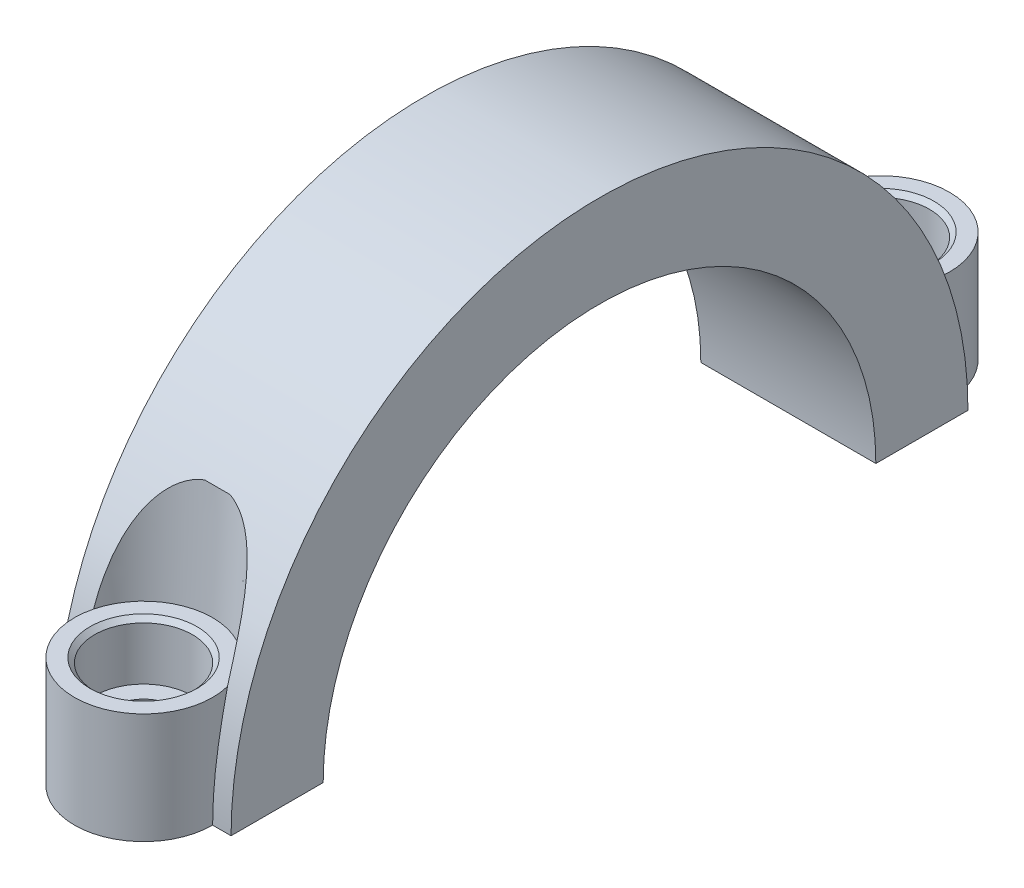
ISO-10303-21;
HEADER;
FILE_DESCRIPTION(('STEP AP214'),'2;1');
FILE_NAME('part.step','',(''),(''),'','','');
FILE_SCHEMA(('AUTOMOTIVE_DESIGN { 1 0 10303 214 1 1 1 1 }'));
ENDSEC;
DATA;
#1=APPLICATION_CONTEXT('core data for automotive mechanical design processes');
#2=APPLICATION_PROTOCOL_DEFINITION('international standard','automotive_design',2000,#1);
#3=PRODUCT_CONTEXT('',#1,'mechanical');
#4=PRODUCT('Part','Part','',(#3));
#5=PRODUCT_RELATED_PRODUCT_CATEGORY('part','',(#4));
#6=PRODUCT_DEFINITION_FORMATION('','',#4);
#7=PRODUCT_DEFINITION_CONTEXT('part definition',#1,'design');
#8=PRODUCT_DEFINITION('design','',#6,#7);
#9=PRODUCT_DEFINITION_SHAPE('','',#8);
#10=(LENGTH_UNIT() NAMED_UNIT(*) SI_UNIT(.MILLI.,.METRE.));
#11=(NAMED_UNIT(*) PLANE_ANGLE_UNIT() SI_UNIT($,.RADIAN.));
#12=(NAMED_UNIT(*) SI_UNIT($,.STERADIAN.) SOLID_ANGLE_UNIT());
#13=UNCERTAINTY_MEASURE_WITH_UNIT(LENGTH_MEASURE(1.E-05),#10,'distance_accuracy_value','');
#14=(GEOMETRIC_REPRESENTATION_CONTEXT(3) GLOBAL_UNCERTAINTY_ASSIGNED_CONTEXT((#13)) GLOBAL_UNIT_ASSIGNED_CONTEXT((#10,
#11,#12)) REPRESENTATION_CONTEXT('',''));
#15=CARTESIAN_POINT('',(0.,0.,0.));
#16=DIRECTION('',(0.,0.,1.));
#17=DIRECTION('',(1.,0.,0.));
#18=AXIS2_PLACEMENT_3D('',#15,#16,#17);
#19=CARTESIAN_POINT('',(12.065,0.,0.));
#20=DIRECTION('',(-1.,0.,0.));
#21=DIRECTION('',(0.,0.,1.));
#22=AXIS2_PLACEMENT_3D('',#19,#20,#21);
#23=CYLINDRICAL_SURFACE('',#22,50.8);
#24=CARTESIAN_POINT('',(-1.74810457967087,30.5001999999993,40.6248421530477));
#25=CARTESIAN_POINT('',(-1.8568354046637,30.4734242580065,40.6449440420825));
#26=CARTESIAN_POINT('',(-1.96461506856476,30.444235855118,40.6668173928714));
#27=CARTESIAN_POINT('',(-2.17803806368827,30.3812201463151,40.7139168273064));
#28=CARTESIAN_POINT('',(-2.28368188801772,30.3473939255099,40.7391421266555));
#29=CARTESIAN_POINT('',(-2.59667632395839,30.2393755863801,40.8194586556798));
#30=CARTESIAN_POINT('',(-2.80056821437426,30.1585248312205,40.8792802641638));
#31=CARTESIAN_POINT('',(-3.19506335496439,29.9818951349139,41.0089966051173));
#32=CARTESIAN_POINT('',(-3.38579862080393,29.8863108428757,41.0787592062943));
#33=CARTESIAN_POINT('',(-3.75599280339193,29.6811328759652,41.2272530215787));
#34=CARTESIAN_POINT('',(-3.93544637407635,29.5715326328808,41.3059884386685));
#35=CARTESIAN_POINT('',(-4.28122151629117,29.3408836007263,41.4701386464727));
#36=CARTESIAN_POINT('',(-4.44763502829644,29.2199313250939,41.5554962192416));
#37=CARTESIAN_POINT('',(-4.76879422506821,28.9673646556736,41.7319493318611));
#38=CARTESIAN_POINT('',(-4.9235415358787,28.8357517530965,41.8230440688007));
#39=CARTESIAN_POINT('',(-5.37160074208228,28.4259543743484,42.1036146151623));
#40=CARTESIAN_POINT('',(-5.64775256161356,28.1334790781694,42.2998970650332));
#41=CARTESIAN_POINT('',(-6.12316475342047,27.5608466914352,42.6748305325586));
#42=CARTESIAN_POINT('',(-6.32776851283243,27.2842582236463,42.8523368684531));
#43=CARTESIAN_POINT('',(-6.70804916834209,26.7135051121324,43.2104399556085));
#44=CARTESIAN_POINT('',(-6.88370795635845,26.4193296215308,43.3910385640141));
#45=CARTESIAN_POINT('',(-7.20921637040825,25.8163697031315,43.7524736267244));
#46=CARTESIAN_POINT('',(-7.35901462439149,25.5075577154183,43.933309851442));
#47=CARTESIAN_POINT('',(-7.63528981448787,24.8784622827895,44.2925876432252));
#48=CARTESIAN_POINT('',(-7.76176961438247,24.5581802523079,44.4710295018481));
#49=CARTESIAN_POINT('',(-7.98059862253857,23.9458899096399,44.8033621498469));
#50=CARTESIAN_POINT('',(-8.07520592376063,23.6549198465757,44.9576967151852));
#51=CARTESIAN_POINT('',(-8.25000402387554,23.0665852888397,45.2623728806838));
#52=CARTESIAN_POINT('',(-8.33019245211075,22.7692197516473,45.4127138207814));
#53=CARTESIAN_POINT('',(-8.47770592836761,22.1688377267581,45.708803891443));
#54=CARTESIAN_POINT('',(-8.54502271854142,21.8658177473271,45.8545500244589));
#55=CARTESIAN_POINT('',(-8.6681196689924,21.2549963099089,46.1408596167061));
#56=CARTESIAN_POINT('',(-8.72389847199912,20.9471942939605,46.2814224646056));
#57=CARTESIAN_POINT('',(-8.82518495597619,20.327287470648,46.5570240706573));
#58=CARTESIAN_POINT('',(-8.87068779924186,20.0151807097601,46.6920602025571));
#59=CARTESIAN_POINT('',(-8.95251767031163,19.3872858740218,46.9562479889177));
#60=CARTESIAN_POINT('',(-8.98884384249343,19.0714974587677,47.0853990937458));
#61=CARTESIAN_POINT('',(-9.08558249131596,18.1196018208605,47.4635204258882));
#62=CARTESIAN_POINT('',(-9.13381914591335,17.4785538841631,47.7033412486374));
#63=CARTESIAN_POINT('',(-9.1837788662674,16.5699481683109,48.02243595927));
#64=CARTESIAN_POINT('',(-9.1961142929506,16.3066170321325,48.1124909496533));
#65=CARTESIAN_POINT('',(-9.21696579241677,15.7790351982051,48.2880843687869));
#66=CARTESIAN_POINT('',(-9.22549135074911,15.5147884536704,48.3736335415288));
#67=CARTESIAN_POINT('',(-9.23232957278113,15.2498,48.4570283855707));
#68=B_SPLINE_CURVE_WITH_KNOTS('',3,(#24,#25,#26,#27,#28,#29,#30,#31,#32,#33,#34,#35,#36,#37,#38,
#39,#40,#41,#42,#43,#44,#45,#46,#47,#48,#49,#50,#51,#52,#53,#54,#55,#56,#57,#58,#59,#60,#61,#62,
#63,#64,#65,#66,#67),.UNSPECIFIED.,.F.,.F.,(4,2,2,2,2,2,2,2,2,2,2,2,2,2,2,2,2,2,2,2,2,4),(0.,
0.341213107628927,0.682346517509666,1.36311798493352,2.03556424903543,2.70832680041288,
3.37581386167994,4.04320771542488,5.38179191853251,6.54166423525026,7.70225943990003,
8.86513428513789,10.0278662203432,11.0555122274801,12.0833270393313,13.1117990533252,
14.140391982847,15.1694681473675,16.1986402263848,18.2556258390209,19.0913187620293,
19.9249192810881),.UNSPECIFIED.);
#69=CARTESIAN_POINT('',(-1.7489164832741,30.5,40.6249923076916));
#70=VERTEX_POINT('',#69);
#71=CARTESIAN_POINT('',(-9.23232441302876,15.25,48.4569654435768));
#72=VERTEX_POINT('',#71);
#73=EDGE_CURVE('E118',#70,#72,#68,.T.);
#74=ORIENTED_EDGE('',*,*,#73,.F.);
#75=DIRECTION('',(-1.,0.,0.));
#76=VECTOR('',#75,1.);
#77=CARTESIAN_POINT('',(12.065,30.5,40.6249923076916));
#78=LINE('',#77,#76);
#79=CARTESIAN_POINT('',(1.74891648327411,30.5,40.6249923076916));
#80=VERTEX_POINT('',#79);
#81=EDGE_CURVE('E11',#80,#70,#78,.T.);
#82=ORIENTED_EDGE('',*,*,#81,.F.);
#83=CARTESIAN_POINT('',(9.23232957278114,15.2498,48.4570283855707));
#84=CARTESIAN_POINT('',(9.22298649822531,15.6112390349687,48.3432848672202));
#85=CARTESIAN_POINT('',(9.21052850510085,15.9713503762663,48.2255066041689));
#86=CARTESIAN_POINT('',(9.17830831699382,16.6886281216248,47.9820076786568));
#87=CARTESIAN_POINT('',(9.15854460932059,17.0457939001213,47.8562853758091));
#88=CARTESIAN_POINT('',(9.11054828438618,17.7581259994784,47.5965677085706));
#89=CARTESIAN_POINT('',(9.08228296834988,18.1132791068592,47.462542017233));
#90=CARTESIAN_POINT('',(9.01608000914568,18.8196980055838,47.1868911644512));
#91=CARTESIAN_POINT('',(8.97814298556163,19.1709640444355,47.0452664902677));
#92=CARTESIAN_POINT('',(8.89077421878664,19.8727683357458,46.7531715430718));
#93=CARTESIAN_POINT('',(8.84122566445781,20.2232599924548,46.6026238413081));
#94=CARTESIAN_POINT('',(8.72928733233202,20.9190474216239,46.2944726722432));
#95=CARTESIAN_POINT('',(8.66689836171177,21.2643435192249,46.1368696489422));
#96=CARTESIAN_POINT('',(8.52762739183727,21.9483786479849,45.8154040765423));
#97=CARTESIAN_POINT('',(8.45076866795353,22.2871272593235,45.6515519124576));
#98=CARTESIAN_POINT('',(8.28054664686997,22.957529972949,45.3181188133628));
#99=CARTESIAN_POINT('',(8.18718723982793,23.2891857268149,45.1485392362384));
#100=CARTESIAN_POINT('',(8.00084386883684,23.8833054551952,44.8365749835524));
#101=CARTESIAN_POINT('',(7.91101217136217,24.1471773729721,44.6949907251336));
#102=CARTESIAN_POINT('',(7.71762746398641,24.6685375692177,44.4093636841023));
#103=CARTESIAN_POINT('',(7.61407377329413,24.9260255302052,44.2653207798176));
#104=CARTESIAN_POINT('',(7.39192424273649,25.4333290311781,43.9758000665904));
#105=CARTESIAN_POINT('',(7.27334034179466,25.6831504673763,43.8303234801354));
#106=CARTESIAN_POINT('',(7.01956356190707,26.1740126269717,43.5389768250034));
#107=CARTESIAN_POINT('',(6.88437112442846,26.4150535835398,43.3931067668859));
#108=CARTESIAN_POINT('',(6.59411946749222,26.8894877197858,43.1007420678656));
#109=CARTESIAN_POINT('',(6.43884730130628,27.1227592092546,42.9542599231077));
#110=CARTESIAN_POINT('',(6.10803623086916,27.5766205655268,42.6643002858692));
#111=CARTESIAN_POINT('',(5.93249363107998,27.7972081088825,42.5208233469235));
#112=CARTESIAN_POINT('',(5.55988459272484,28.2227887584969,42.2395444634863));
#113=CARTESIAN_POINT('',(5.36284961024929,28.4278039297107,42.1017346211706));
#114=CARTESIAN_POINT('',(4.94609858685613,28.819264952646,41.8347479374077));
#115=CARTESIAN_POINT('',(4.72639792314769,29.0057232274876,41.7055653396758));
#116=CARTESIAN_POINT('',(4.19800127022138,29.4061002349099,41.4245881010868));
#117=CARTESIAN_POINT('',(3.88166663355059,29.6129648660096,41.276670610012));
#118=CARTESIAN_POINT('',(3.38020505846122,29.8885865637079,41.0770663945159));
#119=CARTESIAN_POINT('',(3.20875328375263,29.9746086002907,41.0142982676507));
#120=CARTESIAN_POINT('',(2.85732962279533,30.134062124028,40.8972864064189));
#121=CARTESIAN_POINT('',(2.67736286319171,30.2075010670676,40.8430376256692));
#122=CARTESIAN_POINT('',(2.37244698807321,30.3179303562519,40.7610856224502));
#123=CARTESIAN_POINT('',(2.24962869928319,30.3588171323935,40.7306330919355));
#124=CARTESIAN_POINT('',(2.00100903473111,30.4343048253879,40.6742581793202));
#125=CARTESIAN_POINT('',(1.87520661737305,30.4689035097982,40.6483374062397));
#126=CARTESIAN_POINT('',(1.74810457966819,30.5002,40.6248421530472));
#127=B_SPLINE_CURVE_WITH_KNOTS('',3,(#83,#84,#85,#86,#87,#88,#89,#90,#91,#92,#93,#94,#95,#96,
#97,#98,#99,#100,#101,#102,#103,#104,#105,#106,#107,#108,#109,#110,#111,#112,#113,#114,#115,
#116,#117,#118,#119,#120,#121,#122,#123,#124,#125,#126),.UNSPECIFIED.,.F.,.F.,(4,2,2,2,2,2,2,2,
2,2,2,2,2,2,2,2,2,2,2,2,2,4),(0.,1.13708282785276,2.27440122731111,3.41615115174484,
4.55782795236404,5.71152428614375,6.86514811818203,8.01693189895076,9.16844449952657,
10.1060361278798,11.0436742905268,11.9805722741314,12.9174453596818,13.865224463558,
14.8131766323122,15.7597595434693,16.7057044302074,17.9180407367388,18.5229318806462,
19.1274633583501,19.5261613253271,19.9250005655165),.UNSPECIFIED.);
#128=CARTESIAN_POINT('',(9.23232441302877,15.25,48.4569654435768));
#129=VERTEX_POINT('',#128);
#130=EDGE_CURVE('E115',#129,#80,#127,.T.);
#131=ORIENTED_EDGE('',*,*,#130,.F.);
#132=CARTESIAN_POINT('',(9.525,0.,50.8));
#133=CARTESIAN_POINT('',(9.52499524301062,0.323784108117697,50.7999999648618));
#134=CARTESIAN_POINT('',(9.52500063813278,0.647560039520193,50.796904342456));
#135=CARTESIAN_POINT('',(9.52499030872866,1.29499363071079,50.7845235134187));
#136=CARTESIAN_POINT('',(9.52497458419629,1.61865129046479,50.7752383050037));
#137=CARTESIAN_POINT('',(9.524833601113,2.58925335265447,50.7381022328008));
#138=CARTESIAN_POINT('',(9.52461454281479,3.23586724527518,50.7009709216056));
#139=CARTESIAN_POINT('',(9.5230745866246,4.52327113701146,50.6023152371274));
#140=CARTESIAN_POINT('',(9.52176037301303,5.16407268459376,50.5409400288795));
#141=CARTESIAN_POINT('',(9.51662292577861,6.44289275223287,50.3938822741669));
#142=CARTESIAN_POINT('',(9.51279963935347,7.08091121343648,50.3081992161763));
#143=CARTESIAN_POINT('',(9.50067192560663,8.35324744973299,50.1126489497664));
#144=CARTESIAN_POINT('',(9.49236707769667,8.98756487183997,50.0027794720586));
#145=CARTESIAN_POINT('',(9.46874042044187,10.2514343945848,49.7590414176743));
#146=CARTESIAN_POINT('',(9.45341903193227,10.8809867787166,49.6251742806127));
#147=CARTESIAN_POINT('',(9.42274930643626,11.8228096901995,49.4061326748447));
#148=CARTESIAN_POINT('',(9.41119763481739,12.1372894464317,49.3298174313759));
#149=CARTESIAN_POINT('',(9.38505074642432,12.7646164837407,49.1712235836565));
#150=CARTESIAN_POINT('',(9.37045556794109,13.0774637853049,49.0889450544398));
#151=CARTESIAN_POINT('',(9.33771765798532,13.7014270502219,48.9184577558878));
#152=CARTESIAN_POINT('',(9.31957415274906,14.0125426206999,48.8302476958547));
#153=CARTESIAN_POINT('',(9.27917493970685,14.6328012028205,48.6479769352717));
#154=CARTESIAN_POINT('',(9.25691903983042,14.9419441216318,48.5539159615895));
#155=CARTESIAN_POINT('',(9.23232441302877,15.25,48.4569654435768));
#156=B_SPLINE_CURVE_WITH_KNOTS('',3,(#132,#133,#134,#135,#136,#137,#138,#139,#140,#141,#142,
#143,#144,#145,#146,#147,#148,#149,#150,#151,#152,#153,#154,#155),.UNSPECIFIED.,.F.,.F.,(4,2,2,
2,2,2,2,2,2,2,2,4),(0.,0.971321178069315,1.94264263603894,3.88516441042187,5.81591610707106,
7.74670843679406,9.67768200018313,11.6085397635848,12.5799192903469,13.5512865967242,
14.5228659603849,15.4944907133944),.UNSPECIFIED.);
#157=CARTESIAN_POINT('',(9.525,0.,50.8));
#158=VERTEX_POINT('',#157);
#159=EDGE_CURVE('E130',#158,#129,#156,.T.);
#160=ORIENTED_EDGE('',*,*,#159,.F.);
#161=DIRECTION('',(-1.,0.,0.));
#162=VECTOR('',#161,1.);
#163=CARTESIAN_POINT('',(12.065,0.,50.8));
#164=LINE('',#163,#162);
#165=CARTESIAN_POINT('',(12.065,0.,50.8));
#166=VERTEX_POINT('',#165);
#167=EDGE_CURVE('E256',#166,#158,#164,.T.);
#168=ORIENTED_EDGE('',*,*,#167,.F.);
#169=CARTESIAN_POINT('',(12.065,0.,0.));
#170=DIRECTION('',(1.,0.,0.));
#171=DIRECTION('',(0.,0.,-1.));
#172=AXIS2_PLACEMENT_3D('',#169,#170,#171);
#173=CIRCLE('',#172,50.8);
#174=CARTESIAN_POINT('',(12.065,0.,-50.8));
#175=VERTEX_POINT('',#174);
#176=EDGE_CURVE('E276',#175,#166,#173,.T.);
#177=ORIENTED_EDGE('',*,*,#176,.F.);
#178=DIRECTION('',(-1.,0.,0.));
#179=VECTOR('',#178,1.);
#180=CARTESIAN_POINT('',(12.065,0.,-50.8));
#181=LINE('',#180,#179);
#182=CARTESIAN_POINT('',(9.525,0.,-50.8));
#183=VERTEX_POINT('',#182);
#184=EDGE_CURVE('E270',#175,#183,#181,.T.);
#185=ORIENTED_EDGE('',*,*,#184,.T.);
#186=CARTESIAN_POINT('',(9.525,0.,-50.8));
#187=CARTESIAN_POINT('',(9.52499524301062,0.323784108117703,-50.7999999648618));
#188=CARTESIAN_POINT('',(9.52500063813278,0.647560039520198,-50.796904342456));
#189=CARTESIAN_POINT('',(9.52499030872866,1.2949936307108,-50.7845235134187));
#190=CARTESIAN_POINT('',(9.52497458419629,1.61865129046479,-50.7752383050037));
#191=CARTESIAN_POINT('',(9.524833601113,2.58925335265447,-50.7381022328008));
#192=CARTESIAN_POINT('',(9.52461454281479,3.23586724527518,-50.7009709216056));
#193=CARTESIAN_POINT('',(9.5230745866246,4.52327113701146,-50.6023152371274));
#194=CARTESIAN_POINT('',(9.52176037301303,5.16407268459376,-50.5409400288795));
#195=CARTESIAN_POINT('',(9.51662292577861,6.44289275223287,-50.3938822741669));
#196=CARTESIAN_POINT('',(9.51279963935347,7.08091121343648,-50.3081992161763));
#197=CARTESIAN_POINT('',(9.50067192560663,8.353247449733,-50.1126489497664));
#198=CARTESIAN_POINT('',(9.49236707769667,8.98756487183997,-50.0027794720586));
#199=CARTESIAN_POINT('',(9.46874042044187,10.2514343945848,-49.7590414176743));
#200=CARTESIAN_POINT('',(9.45341903193227,10.8809867787166,-49.6251742806127));
#201=CARTESIAN_POINT('',(9.42274930643626,11.8228096901995,-49.4061326748447));
#202=CARTESIAN_POINT('',(9.41119763481739,12.1372894464317,-49.3298174313759));
#203=CARTESIAN_POINT('',(9.38505074642432,12.7646164837407,-49.1712235836565));
#204=CARTESIAN_POINT('',(9.37045556794109,13.0774637853049,-49.0889450544398));
#205=CARTESIAN_POINT('',(9.33771765798532,13.7014270502219,-48.9184577558878));
#206=CARTESIAN_POINT('',(9.31957415274906,14.0125426206999,-48.8302476958547));
#207=CARTESIAN_POINT('',(9.27917493970685,14.6328012028205,-48.6479769352717));
#208=CARTESIAN_POINT('',(9.25691903983042,14.9419441216318,-48.5539159615895));
#209=CARTESIAN_POINT('',(9.23232441302877,15.25,-48.4569654435768));
#210=B_SPLINE_CURVE_WITH_KNOTS('',3,(#186,#187,#188,#189,#190,#191,#192,#193,#194,#195,#196,
#197,#198,#199,#200,#201,#202,#203,#204,#205,#206,#207,#208,#209),.UNSPECIFIED.,.F.,.F.,(4,2,2,
2,2,2,2,2,2,2,2,4),(0.,0.971321178069314,1.94264263603894,3.88516441042187,5.81591610707106,
7.74670843679406,9.67768200018313,11.6085397635848,12.5799192903469,13.5512865967242,
14.5228659603849,15.4944907133944),.UNSPECIFIED.);
#211=CARTESIAN_POINT('',(9.23232441302876,15.25,-48.4569654435768));
#212=VERTEX_POINT('',#211);
#213=EDGE_CURVE('E222',#183,#212,#210,.T.);
#214=ORIENTED_EDGE('',*,*,#213,.T.);
#215=CARTESIAN_POINT('',(9.23232957278114,15.2498,-48.4570283855707));
#216=CARTESIAN_POINT('',(9.22298649822531,15.6112390349687,-48.3432848672202));
#217=CARTESIAN_POINT('',(9.21052850510085,15.9713503762663,-48.2255066041689));
#218=CARTESIAN_POINT('',(9.17830831699382,16.6886281216248,-47.9820076786568));
#219=CARTESIAN_POINT('',(9.15854460932059,17.0457939001213,-47.8562853758091));
#220=CARTESIAN_POINT('',(9.11054828438618,17.7581259994784,-47.5965677085706));
#221=CARTESIAN_POINT('',(9.08228296834988,18.1132791068592,-47.462542017233));
#222=CARTESIAN_POINT('',(9.01608000914568,18.8196980055838,-47.1868911644512));
#223=CARTESIAN_POINT('',(8.97814298556163,19.1709640444355,-47.0452664902677));
#224=CARTESIAN_POINT('',(8.89077421878664,19.8727683357458,-46.7531715430718));
#225=CARTESIAN_POINT('',(8.84122566445781,20.2232599924548,-46.6026238413081));
#226=CARTESIAN_POINT('',(8.72928733233202,20.9190474216239,-46.2944726722432));
#227=CARTESIAN_POINT('',(8.66689836171177,21.2643435192249,-46.1368696489422));
#228=CARTESIAN_POINT('',(8.52762739183727,21.9483786479849,-45.8154040765423));
#229=CARTESIAN_POINT('',(8.45076866795353,22.2871272593235,-45.6515519124576));
#230=CARTESIAN_POINT('',(8.28054664686997,22.957529972949,-45.3181188133628));
#231=CARTESIAN_POINT('',(8.18718723982793,23.2891857268149,-45.1485392362384));
#232=CARTESIAN_POINT('',(8.00084386883684,23.8833054551952,-44.8365749835524));
#233=CARTESIAN_POINT('',(7.91101217136217,24.1471773729721,-44.6949907251336));
#234=CARTESIAN_POINT('',(7.71762746398641,24.6685375692177,-44.4093636841023));
#235=CARTESIAN_POINT('',(7.61407377329413,24.9260255302052,-44.2653207798176));
#236=CARTESIAN_POINT('',(7.39192424273649,25.4333290311781,-43.9758000665904));
#237=CARTESIAN_POINT('',(7.27334034179466,25.6831504673763,-43.8303234801354));
#238=CARTESIAN_POINT('',(7.01956356190707,26.1740126269717,-43.5389768250034));
#239=CARTESIAN_POINT('',(6.88437112442846,26.4150535835398,-43.3931067668859));
#240=CARTESIAN_POINT('',(6.59411946749222,26.8894877197858,-43.1007420678656));
#241=CARTESIAN_POINT('',(6.43884730130628,27.1227592092546,-42.9542599231077));
#242=CARTESIAN_POINT('',(6.10803623086916,27.5766205655268,-42.6643002858692));
#243=CARTESIAN_POINT('',(5.93249363107998,27.7972081088825,-42.5208233469235));
#244=CARTESIAN_POINT('',(5.55988459272484,28.2227887584969,-42.2395444634863));
#245=CARTESIAN_POINT('',(5.36284961024929,28.4278039297107,-42.1017346211706));
#246=CARTESIAN_POINT('',(4.94609858685613,28.819264952646,-41.8347479374077));
#247=CARTESIAN_POINT('',(4.72639792314769,29.0057232274876,-41.7055653396758));
#248=CARTESIAN_POINT('',(4.19800127022138,29.4061002349099,-41.4245881010868));
#249=CARTESIAN_POINT('',(3.88166663355059,29.6129648660096,-41.276670610012));
#250=CARTESIAN_POINT('',(3.38020505846122,29.8885865637079,-41.0770663945159));
#251=CARTESIAN_POINT('',(3.20875328375263,29.9746086002907,-41.0142982676507));
#252=CARTESIAN_POINT('',(2.85732962279533,30.134062124028,-40.8972864064189));
#253=CARTESIAN_POINT('',(2.67736286319171,30.2075010670676,-40.8430376256692));
#254=CARTESIAN_POINT('',(2.37244698807321,30.3179303562519,-40.7610856224502));
#255=CARTESIAN_POINT('',(2.24962869928319,30.3588171323935,-40.7306330919355));
#256=CARTESIAN_POINT('',(2.00100903473111,30.4343048253879,-40.6742581793202));
#257=CARTESIAN_POINT('',(1.87520661737305,30.4689035097982,-40.6483374062397));
#258=CARTESIAN_POINT('',(1.74810457966819,30.5002,-40.6248421530472));
#259=B_SPLINE_CURVE_WITH_KNOTS('',3,(#215,#216,#217,#218,#219,#220,#221,#222,#223,#224,#225,
#226,#227,#228,#229,#230,#231,#232,#233,#234,#235,#236,#237,#238,#239,#240,#241,#242,#243,#244,
#245,#246,#247,#248,#249,#250,#251,#252,#253,#254,#255,#256,#257,#258),.UNSPECIFIED.,.F.,.F.,(4,
2,2,2,2,2,2,2,2,2,2,2,2,2,2,2,2,2,2,2,2,4),(0.,1.13708282785276,2.27440122731111,
3.41615115174484,4.55782795236404,5.71152428614375,6.86514811818203,8.01693189895076,
9.16844449952657,10.1060361278798,11.0436742905268,11.9805722741314,12.9174453596818,
13.865224463558,14.8131766323122,15.7597595434693,16.7057044302074,17.9180407367388,
18.5229318806462,19.1274633583501,19.5261613253271,19.9250005655165),.UNSPECIFIED.);
#260=CARTESIAN_POINT('',(1.74891648327411,30.5,-40.6249923076916));
#261=VERTEX_POINT('',#260);
#262=EDGE_CURVE('E195',#212,#261,#259,.T.);
#263=ORIENTED_EDGE('',*,*,#262,.T.);
#264=DIRECTION('',(-1.,0.,0.));
#265=VECTOR('',#264,1.);
#266=CARTESIAN_POINT('',(12.065,30.5,-40.6249923076916));
#267=LINE('',#266,#265);
#268=CARTESIAN_POINT('',(-1.7489164832741,30.5,-40.6249923076916));
#269=VERTEX_POINT('',#268);
#270=EDGE_CURVE('E44',#269,#261,#267,.F.);
#271=ORIENTED_EDGE('',*,*,#270,.F.);
#272=CARTESIAN_POINT('',(-1.74810457967087,30.5001999999993,-40.6248421530477));
#273=CARTESIAN_POINT('',(-1.8568354046637,30.4734242580065,-40.6449440420825));
#274=CARTESIAN_POINT('',(-1.96461506856476,30.444235855118,-40.6668173928714));
#275=CARTESIAN_POINT('',(-2.17803806368827,30.3812201463151,-40.7139168273064));
#276=CARTESIAN_POINT('',(-2.28368188801772,30.3473939255099,-40.7391421266555));
#277=CARTESIAN_POINT('',(-2.59667632395839,30.2393755863801,-40.8194586556798));
#278=CARTESIAN_POINT('',(-2.80056821437426,30.1585248312205,-40.8792802641638));
#279=CARTESIAN_POINT('',(-3.19506335496439,29.9818951349139,-41.0089966051173));
#280=CARTESIAN_POINT('',(-3.38579862080393,29.8863108428757,-41.0787592062943));
#281=CARTESIAN_POINT('',(-3.75599280339193,29.6811328759652,-41.2272530215787));
#282=CARTESIAN_POINT('',(-3.93544637407635,29.5715326328808,-41.3059884386685));
#283=CARTESIAN_POINT('',(-4.28122151629117,29.3408836007263,-41.4701386464727));
#284=CARTESIAN_POINT('',(-4.44763502829644,29.2199313250939,-41.5554962192416));
#285=CARTESIAN_POINT('',(-4.76879422506821,28.9673646556736,-41.7319493318611));
#286=CARTESIAN_POINT('',(-4.9235415358787,28.8357517530965,-41.8230440688007));
#287=CARTESIAN_POINT('',(-5.37160074208228,28.4259543743484,-42.1036146151623));
#288=CARTESIAN_POINT('',(-5.64775256161356,28.1334790781694,-42.2998970650332));
#289=CARTESIAN_POINT('',(-6.12316475342047,27.5608466914352,-42.6748305325586));
#290=CARTESIAN_POINT('',(-6.32776851283243,27.2842582236463,-42.8523368684531));
#291=CARTESIAN_POINT('',(-6.70804916834209,26.7135051121324,-43.2104399556085));
#292=CARTESIAN_POINT('',(-6.88370795635845,26.4193296215308,-43.3910385640141));
#293=CARTESIAN_POINT('',(-7.20921637040825,25.8163697031315,-43.7524736267244));
#294=CARTESIAN_POINT('',(-7.35901462439149,25.5075577154183,-43.933309851442));
#295=CARTESIAN_POINT('',(-7.63528981448787,24.8784622827895,-44.2925876432252));
#296=CARTESIAN_POINT('',(-7.76176961438247,24.5581802523079,-44.4710295018481));
#297=CARTESIAN_POINT('',(-7.98059862253857,23.9458899096399,-44.8033621498469));
#298=CARTESIAN_POINT('',(-8.07520592376063,23.6549198465757,-44.9576967151852));
#299=CARTESIAN_POINT('',(-8.25000402387554,23.0665852888397,-45.2623728806838));
#300=CARTESIAN_POINT('',(-8.33019245211075,22.7692197516473,-45.4127138207814));
#301=CARTESIAN_POINT('',(-8.47770592836761,22.1688377267581,-45.708803891443));
#302=CARTESIAN_POINT('',(-8.54502271854142,21.8658177473271,-45.8545500244589));
#303=CARTESIAN_POINT('',(-8.6681196689924,21.2549963099089,-46.1408596167061));
#304=CARTESIAN_POINT('',(-8.72389847199912,20.9471942939605,-46.2814224646056));
#305=CARTESIAN_POINT('',(-8.82518495597619,20.327287470648,-46.5570240706573));
#306=CARTESIAN_POINT('',(-8.87068779924186,20.0151807097601,-46.6920602025571));
#307=CARTESIAN_POINT('',(-8.95251767031163,19.3872858740218,-46.9562479889177));
#308=CARTESIAN_POINT('',(-8.98884384249343,19.0714974587677,-47.0853990937458));
#309=CARTESIAN_POINT('',(-9.08558249131596,18.1196018208605,-47.4635204258882));
#310=CARTESIAN_POINT('',(-9.13381914591335,17.4785538841631,-47.7033412486374));
#311=CARTESIAN_POINT('',(-9.1837788662674,16.5699481683109,-48.02243595927));
#312=CARTESIAN_POINT('',(-9.1961142929506,16.3066170321325,-48.1124909496533));
#313=CARTESIAN_POINT('',(-9.21696579241677,15.7790351982051,-48.2880843687869));
#314=CARTESIAN_POINT('',(-9.22549135074911,15.5147884536704,-48.3736335415288));
#315=CARTESIAN_POINT('',(-9.23232957278113,15.2498,-48.4570283855707));
#316=B_SPLINE_CURVE_WITH_KNOTS('',3,(#272,#273,#274,#275,#276,#277,#278,#279,#280,#281,#282,
#283,#284,#285,#286,#287,#288,#289,#290,#291,#292,#293,#294,#295,#296,#297,#298,#299,#300,#301,
#302,#303,#304,#305,#306,#307,#308,#309,#310,#311,#312,#313,#314,#315),.UNSPECIFIED.,.F.,.F.,(4,
2,2,2,2,2,2,2,2,2,2,2,2,2,2,2,2,2,2,2,2,4),(0.,0.341213107628927,0.682346517509666,
1.36311798493352,2.03556424903543,2.70832680041288,3.37581386167994,4.04320771542488,
5.38179191853251,6.54166423525026,7.70225943990003,8.86513428513789,10.0278662203432,
11.0555122274801,12.0833270393313,13.1117990533252,14.140391982847,15.1694681473675,
16.1986402263848,18.2556258390209,19.0913187620293,19.9249192810881),.UNSPECIFIED.);
#317=CARTESIAN_POINT('',(-9.23232441302876,15.25,-48.4569654435768));
#318=VERTEX_POINT('',#317);
#319=EDGE_CURVE('E202',#269,#318,#316,.T.);
#320=ORIENTED_EDGE('',*,*,#319,.T.);
#321=CARTESIAN_POINT('',(-9.23232441302876,15.25,-48.4569654435768));
#322=CARTESIAN_POINT('',(-9.25691903983042,14.9419441216318,-48.5539159615895));
#323=CARTESIAN_POINT('',(-9.27917493970685,14.6328012028205,-48.6479769352717));
#324=CARTESIAN_POINT('',(-9.31957415274906,14.0125426206999,-48.8302476958547));
#325=CARTESIAN_POINT('',(-9.33771765798532,13.7014270502219,-48.9184577558878));
#326=CARTESIAN_POINT('',(-9.37045556794108,13.0774637853049,-49.0889450544398));
#327=CARTESIAN_POINT('',(-9.38505074642431,12.7646164837407,-49.1712235836565));
#328=CARTESIAN_POINT('',(-9.41119763481738,12.1372894464317,-49.3298174313758));
#329=CARTESIAN_POINT('',(-9.42274930643625,11.8228096901995,-49.4061326748446));
#330=CARTESIAN_POINT('',(-9.45341903193226,10.8809867787166,-49.6251742806127));
#331=CARTESIAN_POINT('',(-9.46874042044186,10.2514343945849,-49.7590414176743));
#332=CARTESIAN_POINT('',(-9.49236707769666,8.98756487183998,-50.0027794720585));
#333=CARTESIAN_POINT('',(-9.50067192560662,8.35324744973301,-50.1126489497664));
#334=CARTESIAN_POINT('',(-9.51279963935347,7.0809112134365,-50.3081992161763));
#335=CARTESIAN_POINT('',(-9.5166229257786,6.4428927522329,-50.3938822741669));
#336=CARTESIAN_POINT('',(-9.52176037301302,5.16407268459379,-50.5409400288795));
#337=CARTESIAN_POINT('',(-9.52307458662458,4.52327113701149,-50.6023152371274));
#338=CARTESIAN_POINT('',(-9.52461454281479,3.23586724527522,-50.7009709216056));
#339=CARTESIAN_POINT('',(-9.52483360111304,2.58925335265451,-50.7381022328008));
#340=CARTESIAN_POINT('',(-9.52497458419626,1.61865129046483,-50.7752383050037));
#341=CARTESIAN_POINT('',(-9.52499030872859,1.29499363071084,-50.7845235134187));
#342=CARTESIAN_POINT('',(-9.52500063813284,0.647560039520247,-50.796904342456));
#343=CARTESIAN_POINT('',(-9.52499524301084,0.323784108117753,-50.7999999648618));
#344=CARTESIAN_POINT('',(-9.5250000000006,0.,-50.8));
#345=B_SPLINE_CURVE_WITH_KNOTS('',3,(#321,#322,#323,#324,#325,#326,#327,#328,#329,#330,#331,
#332,#333,#334,#335,#336,#337,#338,#339,#340,#341,#342,#343,#344),.UNSPECIFIED.,.F.,.F.,(4,2,2,
2,2,2,2,2,2,2,2,4),(0.,0.971624753009543,1.94320411667025,2.9145714230475,3.88595094980956,
5.81680871321127,7.74778227660034,9.67857460632333,11.6093263029725,13.5518480773554,
14.5231695353251,15.4944907133944),.UNSPECIFIED.);
#346=CARTESIAN_POINT('',(-9.525,0.,-50.8));
#347=VERTEX_POINT('',#346);
#348=EDGE_CURVE('E213',#318,#347,#345,.T.);
#349=ORIENTED_EDGE('',*,*,#348,.T.);
#350=CARTESIAN_POINT('',(-12.065,0.,-50.8));
#351=VERTEX_POINT('',#350);
#352=EDGE_CURVE('E272',#347,#351,#181,.T.);
#353=ORIENTED_EDGE('',*,*,#352,.T.);
#354=CARTESIAN_POINT('',(-12.065,0.,0.));
#355=DIRECTION('',(1.,0.,0.));
#356=DIRECTION('',(0.,0.,-1.));
#357=AXIS2_PLACEMENT_3D('',#354,#355,#356);
#358=CIRCLE('',#357,50.8);
#359=CARTESIAN_POINT('',(-12.065,0.,50.8));
#360=VERTEX_POINT('',#359);
#361=EDGE_CURVE('E281',#351,#360,#358,.T.);
#362=ORIENTED_EDGE('',*,*,#361,.T.);
#363=CARTESIAN_POINT('',(-9.52499999999999,0.,50.8));
#364=VERTEX_POINT('',#363);
#365=EDGE_CURVE('E261',#364,#360,#164,.T.);
#366=ORIENTED_EDGE('',*,*,#365,.F.);
#367=CARTESIAN_POINT('',(-9.23232441302876,15.25,48.4569654435768));
#368=CARTESIAN_POINT('',(-9.25691903983042,14.9419441216318,48.5539159615895));
#369=CARTESIAN_POINT('',(-9.27917493970685,14.6328012028205,48.6479769352717));
#370=CARTESIAN_POINT('',(-9.31957415274905,14.0125426206999,48.8302476958547));
#371=CARTESIAN_POINT('',(-9.33771765798531,13.7014270502219,48.9184577558878));
#372=CARTESIAN_POINT('',(-9.37045556794108,13.0774637853049,49.0889450544398));
#373=CARTESIAN_POINT('',(-9.38505074642431,12.7646164837407,49.1712235836565));
#374=CARTESIAN_POINT('',(-9.41119763481738,12.1372894464317,49.3298174313758));
#375=CARTESIAN_POINT('',(-9.42274930643625,11.8228096901995,49.4061326748447));
#376=CARTESIAN_POINT('',(-9.45341903193226,10.8809867787166,49.6251742806127));
#377=CARTESIAN_POINT('',(-9.46874042044186,10.2514343945849,49.7590414176743));
#378=CARTESIAN_POINT('',(-9.49236707769666,8.98756487183999,50.0027794720586));
#379=CARTESIAN_POINT('',(-9.50067192560662,8.35324744973301,50.1126489497664));
#380=CARTESIAN_POINT('',(-9.51279963935347,7.0809112134365,50.3081992161763));
#381=CARTESIAN_POINT('',(-9.5166229257786,6.4428927522329,50.3938822741669));
#382=CARTESIAN_POINT('',(-9.52176037301302,5.16407268459379,50.5409400288795));
#383=CARTESIAN_POINT('',(-9.52307458662458,4.52327113701149,50.6023152371274));
#384=CARTESIAN_POINT('',(-9.52461454281479,3.23586724527522,50.7009709216056));
#385=CARTESIAN_POINT('',(-9.52483360111304,2.58925335265451,50.7381022328008));
#386=CARTESIAN_POINT('',(-9.52497458419626,1.61865129046483,50.7752383050037));
#387=CARTESIAN_POINT('',(-9.52499030872859,1.29499363071084,50.7845235134187));
#388=CARTESIAN_POINT('',(-9.52500063813284,0.647560039520243,50.796904342456));
#389=CARTESIAN_POINT('',(-9.52499524301084,0.32378410811775,50.7999999648618));
#390=CARTESIAN_POINT('',(-9.5250000000006,0.,50.8));
#391=B_SPLINE_CURVE_WITH_KNOTS('',3,(#367,#368,#369,#370,#371,#372,#373,#374,#375,#376,#377,
#378,#379,#380,#381,#382,#383,#384,#385,#386,#387,#388,#389,#390),.UNSPECIFIED.,.F.,.F.,(4,2,2,
2,2,2,2,2,2,2,2,4),(0.,0.971624753009543,1.94320411667025,2.9145714230475,3.88595094980956,
5.81680871321127,7.74778227660034,9.67857460632333,11.6093263029725,13.5518480773554,
14.5231695353251,15.4944907133944),.UNSPECIFIED.);
#392=EDGE_CURVE('E137',#72,#364,#391,.T.);
#393=ORIENTED_EDGE('',*,*,#392,.F.);
#394=EDGE_LOOP('',(#74,#82,#131,#160,#168,#177,#185,#214,#263,#271,#320,#349,#353,#362,#366,#393));
#395=FACE_BOUND('',#394,.T.);
#396=ADVANCED_FACE('F36',(#395),#23,.T.);
#397=CARTESIAN_POINT('',(12.065,0.,50.8));
#398=DIRECTION('',(0.,1.,0.));
#399=DIRECTION('',(0.,0.,1.));
#400=AXIS2_PLACEMENT_3D('',#397,#398,#399);
#401=PLANE('',#400);
#402=CARTESIAN_POINT('',(0.,0.,50.8));
#403=DIRECTION('',(0.,1.,0.));
#404=DIRECTION('',(0.,0.,1.));
#405=AXIS2_PLACEMENT_3D('',#402,#403,#404);
#406=CIRCLE('',#405,4.2164);
#407=CARTESIAN_POINT('',(0.,0.,55.0164));
#408=VERTEX_POINT('',#407);
#409=EDGE_CURVE('E123',#408,#408,#406,.T.);
#410=ORIENTED_EDGE('',*,*,#409,.T.);
#411=EDGE_LOOP('',(#410));
#412=FACE_BOUND('',#411,.T.);
#413=ORIENTED_EDGE('',*,*,#167,.T.);
#414=CARTESIAN_POINT('',(0.,0.,50.8));
#415=DIRECTION('',(0.,1.,0.));
#416=DIRECTION('',(0.,0.,1.));
#417=AXIS2_PLACEMENT_3D('',#414,#415,#416);
#418=CIRCLE('',#417,9.525);
#419=EDGE_CURVE('E51',#364,#158,#418,.T.);
#420=ORIENTED_EDGE('',*,*,#419,.F.);
#421=ORIENTED_EDGE('',*,*,#365,.T.);
#422=DIRECTION('',(0.,0.,-1.));
#423=VECTOR('',#422,1.);
#424=CARTESIAN_POINT('',(-12.065,0.,50.8));
#425=LINE('',#424,#423);
#426=CARTESIAN_POINT('',(-12.065,0.,38.1));
#427=VERTEX_POINT('',#426);
#428=EDGE_CURVE('E279',#360,#427,#425,.T.);
#429=ORIENTED_EDGE('',*,*,#428,.T.);
#430=DIRECTION('',(-1.,0.,0.));
#431=VECTOR('',#430,1.);
#432=CARTESIAN_POINT('',(12.065,0.,38.1));
#433=LINE('',#432,#431);
#434=CARTESIAN_POINT('',(12.065,0.,38.1));
#435=VERTEX_POINT('',#434);
#436=EDGE_CURVE('E263',#435,#427,#433,.T.);
#437=ORIENTED_EDGE('',*,*,#436,.F.);
#438=DIRECTION('',(0.,0.,-1.));
#439=VECTOR('',#438,1.);
#440=CARTESIAN_POINT('',(12.065,0.,50.8));
#441=LINE('',#440,#439);
#442=EDGE_CURVE('E258',#166,#435,#441,.T.);
#443=ORIENTED_EDGE('',*,*,#442,.F.);
#444=EDGE_LOOP('',(#413,#420,#421,#429,#437,#443));
#445=FACE_BOUND('',#444,.T.);
#446=ADVANCED_FACE('F247',(#412,#445),#401,.F.);
#447=CARTESIAN_POINT('',(12.065,0.,0.));
#448=DIRECTION('',(-1.,0.,0.));
#449=DIRECTION('',(0.,0.,1.));
#450=AXIS2_PLACEMENT_3D('',#447,#448,#449);
#451=CYLINDRICAL_SURFACE('',#450,38.1);
#452=CARTESIAN_POINT('',(-12.065,0.,0.));
#453=DIRECTION('',(-1.,0.,0.));
#454=DIRECTION('',(0.,0.,-1.));
#455=AXIS2_PLACEMENT_3D('',#452,#453,#454);
#456=CIRCLE('',#455,38.1);
#457=CARTESIAN_POINT('',(-12.065,0.,-38.1));
#458=VERTEX_POINT('',#457);
#459=EDGE_CURVE('E277',#427,#458,#456,.T.);
#460=ORIENTED_EDGE('',*,*,#459,.T.);
#461=DIRECTION('',(-1.,0.,0.));
#462=VECTOR('',#461,1.);
#463=CARTESIAN_POINT('',(12.065,0.,-38.1));
#464=LINE('',#463,#462);
#465=CARTESIAN_POINT('',(12.065,0.,-38.1));
#466=VERTEX_POINT('',#465);
#467=EDGE_CURVE('E267',#466,#458,#464,.T.);
#468=ORIENTED_EDGE('',*,*,#467,.F.);
#469=CARTESIAN_POINT('',(12.065,0.,0.));
#470=DIRECTION('',(-1.,0.,0.));
#471=DIRECTION('',(0.,0.,-1.));
#472=AXIS2_PLACEMENT_3D('',#469,#470,#471);
#473=CIRCLE('',#472,38.1);
#474=EDGE_CURVE('E286',#435,#466,#473,.T.);
#475=ORIENTED_EDGE('',*,*,#474,.F.);
#476=ORIENTED_EDGE('',*,*,#436,.T.);
#477=EDGE_LOOP('',(#460,#468,#475,#476));
#478=FACE_BOUND('',#477,.T.);
#479=ADVANCED_FACE('F244',(#478),#451,.F.);
#480=CARTESIAN_POINT('',(12.065,0.,-38.1));
#481=DIRECTION('',(0.,1.,0.));
#482=DIRECTION('',(0.,0.,1.));
#483=AXIS2_PLACEMENT_3D('',#480,#481,#482);
#484=PLANE('',#483);
#485=CARTESIAN_POINT('',(0.,0.,-50.8));
#486=DIRECTION('',(0.,1.,0.));
#487=DIRECTION('',(0.,0.,1.));
#488=AXIS2_PLACEMENT_3D('',#485,#486,#487);
#489=CIRCLE('',#488,4.2164);
#490=CARTESIAN_POINT('',(0.,0.,-46.5836));
#491=VERTEX_POINT('',#490);
#492=EDGE_CURVE('E316',#491,#491,#489,.T.);
#493=ORIENTED_EDGE('',*,*,#492,.T.);
#494=EDGE_LOOP('',(#493));
#495=FACE_BOUND('',#494,.T.);
#496=ORIENTED_EDGE('',*,*,#352,.F.);
#497=CARTESIAN_POINT('',(0.,0.,-50.8));
#498=DIRECTION('',(0.,-1.,0.));
#499=DIRECTION('',(0.,0.,-1.));
#500=AXIS2_PLACEMENT_3D('',#497,#498,#499);
#501=CIRCLE('',#500,9.525);
#502=EDGE_CURVE('E209',#347,#183,#501,.T.);
#503=ORIENTED_EDGE('',*,*,#502,.T.);
#504=ORIENTED_EDGE('',*,*,#184,.F.);
#505=DIRECTION('',(0.,0.,-1.));
#506=VECTOR('',#505,1.);
#507=CARTESIAN_POINT('',(12.065,0.,-38.1));
#508=LINE('',#507,#506);
#509=EDGE_CURVE('E284',#466,#175,#508,.T.);
#510=ORIENTED_EDGE('',*,*,#509,.F.);
#511=ORIENTED_EDGE('',*,*,#467,.T.);
#512=DIRECTION('',(0.,0.,-1.));
#513=VECTOR('',#512,1.);
#514=CARTESIAN_POINT('',(-12.065,0.,-38.1));
#515=LINE('',#514,#513);
#516=EDGE_CURVE('E273',#458,#351,#515,.T.);
#517=ORIENTED_EDGE('',*,*,#516,.T.);
#518=EDGE_LOOP('',(#496,#503,#504,#510,#511,#517));
#519=FACE_BOUND('',#518,.T.);
#520=ADVANCED_FACE('F237',(#495,#519),#484,.F.);
#521=CARTESIAN_POINT('',(12.065,0.,0.));
#522=DIRECTION('',(1.,0.,0.));
#523=DIRECTION('',(0.,0.,-1.));
#524=AXIS2_PLACEMENT_3D('',#521,#522,#523);
#525=PLANE('',#524);
#526=ORIENTED_EDGE('',*,*,#176,.T.);
#527=ORIENTED_EDGE('',*,*,#442,.T.);
#528=ORIENTED_EDGE('',*,*,#474,.T.);
#529=ORIENTED_EDGE('',*,*,#509,.T.);
#530=EDGE_LOOP('',(#526,#527,#528,#529));
#531=FACE_BOUND('',#530,.T.);
#532=ADVANCED_FACE('F232',(#531),#525,.T.);
#533=CARTESIAN_POINT('',(-12.065,0.,0.));
#534=DIRECTION('',(1.,0.,0.));
#535=DIRECTION('',(0.,0.,-1.));
#536=AXIS2_PLACEMENT_3D('',#533,#534,#535);
#537=PLANE('',#536);
#538=ORIENTED_EDGE('',*,*,#361,.F.);
#539=ORIENTED_EDGE('',*,*,#516,.F.);
#540=ORIENTED_EDGE('',*,*,#459,.F.);
#541=ORIENTED_EDGE('',*,*,#428,.F.);
#542=EDGE_LOOP('',(#538,#539,#540,#541));
#543=FACE_BOUND('',#542,.T.);
#544=ADVANCED_FACE('F236',(#543),#537,.F.);
#545=CARTESIAN_POINT('',(0.,15.25,-50.8));
#546=DIRECTION('',(0.,-1.,0.));
#547=DIRECTION('',(0.,0.,-1.));
#548=AXIS2_PLACEMENT_3D('',#545,#546,#547);
#549=PLANE('',#548);
#550=CARTESIAN_POINT('',(0.,15.25,-50.8));
#551=DIRECTION('',(0.,1.,0.));
#552=DIRECTION('',(0.,0.,1.));
#553=AXIS2_PLACEMENT_3D('',#550,#551,#552);
#554=CIRCLE('',#553,7.38251);
#555=CARTESIAN_POINT('',(0.,15.25,-43.41749));
#556=VERTEX_POINT('',#555);
#557=EDGE_CURVE('E136',#556,#556,#554,.T.);
#558=ORIENTED_EDGE('',*,*,#557,.F.);
#559=EDGE_LOOP('',(#558));
#560=FACE_BOUND('',#559,.T.);
#561=CARTESIAN_POINT('',(0.,15.25,-50.8));
#562=DIRECTION('',(0.,-1.,0.));
#563=DIRECTION('',(0.,0.,-1.));
#564=AXIS2_PLACEMENT_3D('',#561,#562,#563);
#565=CIRCLE('',#564,9.525);
#566=EDGE_CURVE('E210',#318,#212,#565,.T.);
#567=ORIENTED_EDGE('',*,*,#566,.F.);
#568=CARTESIAN_POINT('',(0.,15.25,-50.8));
#569=DIRECTION('',(0.,-1.,0.));
#570=DIRECTION('',(0.,0.,-1.));
#571=AXIS2_PLACEMENT_3D('',#568,#569,#570);
#572=CIRCLE('',#571,9.525);
#573=EDGE_CURVE('E58',#212,#318,#572,.T.);
#574=ORIENTED_EDGE('',*,*,#573,.F.);
#575=EDGE_LOOP('',(#567,#574));
#576=FACE_BOUND('',#575,.T.);
#577=ADVANCED_FACE('F191',(#560,#576),#549,.F.);
#578=CARTESIAN_POINT('',(0.,15.25,-50.8));
#579=DIRECTION('',(0.,-1.,0.));
#580=DIRECTION('',(0.,0.,-1.));
#581=AXIS2_PLACEMENT_3D('',#578,#579,#580);
#582=CYLINDRICAL_SURFACE('',#581,9.525);
#583=ORIENTED_EDGE('',*,*,#213,.F.);
#584=ORIENTED_EDGE('',*,*,#502,.F.);
#585=ORIENTED_EDGE('',*,*,#348,.F.);
#586=ORIENTED_EDGE('',*,*,#566,.T.);
#587=EDGE_LOOP('',(#583,#584,#585,#586));
#588=FACE_BOUND('',#587,.T.);
#589=ADVANCED_FACE('F185',(#588),#582,.T.);
#590=CARTESIAN_POINT('',(0.,30.5,-50.8));
#591=DIRECTION('',(0.,-1.,0.));
#592=DIRECTION('',(0.,0.,-1.));
#593=AXIS2_PLACEMENT_3D('',#590,#591,#592);
#594=PLANE('',#593);
#595=ORIENTED_EDGE('',*,*,#270,.T.);
#596=CARTESIAN_POINT('',(0.,30.5,-50.8));
#597=DIRECTION('',(0.,-1.,0.));
#598=DIRECTION('',(0.,0.,-1.));
#599=AXIS2_PLACEMENT_3D('',#596,#597,#598);
#600=CIRCLE('',#599,10.3242186340664);
#601=EDGE_CURVE('E319',#261,#269,#600,.T.);
#602=ORIENTED_EDGE('',*,*,#601,.T.);
#603=EDGE_LOOP('',(#595,#602));
#604=FACE_BOUND('',#603,.T.);
#605=ADVANCED_FACE('F182',(#604),#594,.T.);
#606=CARTESIAN_POINT('',(0.,15.25,-50.8));
#607=DIRECTION('',(0.,1.,0.));
#608=DIRECTION('',(0.,0.,-1.));
#609=AXIS2_PLACEMENT_3D('',#606,#607,#608);
#610=CONICAL_SURFACE('',#609,9.525,0.05235987755983);
#611=ORIENTED_EDGE('',*,*,#601,.F.);
#612=ORIENTED_EDGE('',*,*,#262,.F.);
#613=ORIENTED_EDGE('',*,*,#573,.T.);
#614=ORIENTED_EDGE('',*,*,#319,.F.);
#615=EDGE_LOOP('',(#611,#612,#613,#614));
#616=FACE_BOUND('',#615,.T.);
#617=ADVANCED_FACE('F180',(#616),#610,.F.);
#618=CARTESIAN_POINT('',(0.,15.25,-50.8));
#619=DIRECTION('',(0.,1.,0.));
#620=DIRECTION('',(0.,0.,1.));
#621=AXIS2_PLACEMENT_3D('',#618,#619,#620);
#622=CYLINDRICAL_SURFACE('',#621,4.2164);
#623=ORIENTED_EDGE('',*,*,#492,.F.);
#624=EDGE_LOOP('',(#623));
#625=FACE_BOUND('',#624,.T.);
#626=CARTESIAN_POINT('',(0.,7.3125,-50.8));
#627=DIRECTION('',(0.,1.,0.));
#628=DIRECTION('',(0.,0.,1.));
#629=AXIS2_PLACEMENT_3D('',#626,#627,#628);
#630=CIRCLE('',#629,4.2164);
#631=CARTESIAN_POINT('',(0.,7.3125,-46.5836));
#632=VERTEX_POINT('',#631);
#633=EDGE_CURVE('E313',#632,#632,#630,.T.);
#634=ORIENTED_EDGE('',*,*,#633,.T.);
#635=EDGE_LOOP('',(#634));
#636=FACE_BOUND('',#635,.T.);
#637=ADVANCED_FACE('F176',(#625,#636),#622,.F.);
#638=CARTESIAN_POINT('',(6.74751,7.3125,-50.8));
#639=DIRECTION('',(0.,-1.,0.));
#640=DIRECTION('',(0.,0.,-1.));
#641=AXIS2_PLACEMENT_3D('',#638,#639,#640);
#642=PLANE('',#641);
#643=ORIENTED_EDGE('',*,*,#633,.F.);
#644=EDGE_LOOP('',(#643));
#645=FACE_BOUND('',#644,.T.);
#646=CARTESIAN_POINT('',(0.,7.3125,-50.8));
#647=DIRECTION('',(0.,1.,0.));
#648=DIRECTION('',(0.,0.,1.));
#649=AXIS2_PLACEMENT_3D('',#646,#647,#648);
#650=CIRCLE('',#649,6.74751);
#651=CARTESIAN_POINT('',(0.,7.3125,-44.05249));
#652=VERTEX_POINT('',#651);
#653=EDGE_CURVE('E308',#652,#652,#650,.T.);
#654=ORIENTED_EDGE('',*,*,#653,.T.);
#655=EDGE_LOOP('',(#654));
#656=FACE_BOUND('',#655,.T.);
#657=ADVANCED_FACE('F172',(#645,#656),#642,.F.);
#658=CARTESIAN_POINT('',(0.,15.25,-50.8));
#659=DIRECTION('',(0.,1.,0.));
#660=DIRECTION('',(0.,0.,1.));
#661=AXIS2_PLACEMENT_3D('',#658,#659,#660);
#662=CYLINDRICAL_SURFACE('',#661,6.74751);
#663=ORIENTED_EDGE('',*,*,#653,.F.);
#664=EDGE_LOOP('',(#663));
#665=FACE_BOUND('',#664,.T.);
#666=CARTESIAN_POINT('',(0.,14.615,-50.8));
#667=DIRECTION('',(0.,1.,0.));
#668=DIRECTION('',(0.,0.,1.));
#669=AXIS2_PLACEMENT_3D('',#666,#667,#668);
#670=CIRCLE('',#669,6.74751);
#671=CARTESIAN_POINT('',(0.,14.615,-44.05249));
#672=VERTEX_POINT('',#671);
#673=EDGE_CURVE('E306',#672,#672,#670,.T.);
#674=ORIENTED_EDGE('',*,*,#673,.T.);
#675=EDGE_LOOP('',(#674));
#676=FACE_BOUND('',#675,.T.);
#677=ADVANCED_FACE('F168',(#665,#676),#662,.F.);
#678=CARTESIAN_POINT('',(0.,15.25,-50.8));
#679=DIRECTION('',(0.,1.,0.));
#680=DIRECTION('',(0.,0.,1.));
#681=AXIS2_PLACEMENT_3D('',#678,#679,#680);
#682=CONICAL_SURFACE('',#681,7.38251,0.785398163397447);
#683=ORIENTED_EDGE('',*,*,#673,.F.);
#684=EDGE_LOOP('',(#683));
#685=FACE_BOUND('',#684,.T.);
#686=ORIENTED_EDGE('',*,*,#557,.T.);
#687=EDGE_LOOP('',(#686));
#688=FACE_BOUND('',#687,.T.);
#689=ADVANCED_FACE('F164',(#685,#688),#682,.F.);
#690=CARTESIAN_POINT('',(0.,15.25,50.8));
#691=DIRECTION('',(0.,-1.,0.));
#692=DIRECTION('',(0.,0.,1.));
#693=AXIS2_PLACEMENT_3D('',#690,#691,#692);
#694=PLANE('',#693);
#695=CARTESIAN_POINT('',(0.,15.25,50.8));
#696=DIRECTION('',(0.,1.,0.));
#697=DIRECTION('',(0.,0.,1.));
#698=AXIS2_PLACEMENT_3D('',#695,#696,#697);
#699=CIRCLE('',#698,7.38251);
#700=CARTESIAN_POINT('',(0.,15.25,58.18251));
#701=VERTEX_POINT('',#700);
#702=EDGE_CURVE('E511',#701,#701,#699,.T.);
#703=ORIENTED_EDGE('',*,*,#702,.F.);
#704=EDGE_LOOP('',(#703));
#705=FACE_BOUND('',#704,.T.);
#706=CARTESIAN_POINT('',(0.,15.25,50.8));
#707=DIRECTION('',(0.,1.,0.));
#708=DIRECTION('',(0.,0.,1.));
#709=AXIS2_PLACEMENT_3D('',#706,#707,#708);
#710=CIRCLE('',#709,9.525);
#711=EDGE_CURVE('E134',#72,#129,#710,.T.);
#712=ORIENTED_EDGE('',*,*,#711,.T.);
#713=CARTESIAN_POINT('',(0.,15.25,50.8));
#714=DIRECTION('',(0.,1.,0.));
#715=DIRECTION('',(0.,0.,1.));
#716=AXIS2_PLACEMENT_3D('',#713,#714,#715);
#717=CIRCLE('',#716,9.525);
#718=EDGE_CURVE('E111',#129,#72,#717,.T.);
#719=ORIENTED_EDGE('',*,*,#718,.T.);
#720=EDGE_LOOP('',(#712,#719));
#721=FACE_BOUND('',#720,.T.);
#722=ADVANCED_FACE('F139',(#705,#721),#694,.F.);
#723=CARTESIAN_POINT('',(0.,15.25,50.8));
#724=DIRECTION('',(0.,-1.,0.));
#725=DIRECTION('',(0.,0.,-1.));
#726=AXIS2_PLACEMENT_3D('',#723,#724,#725);
#727=CYLINDRICAL_SURFACE('',#726,9.525);
#728=ORIENTED_EDGE('',*,*,#419,.T.);
#729=ORIENTED_EDGE('',*,*,#159,.T.);
#730=ORIENTED_EDGE('',*,*,#711,.F.);
#731=ORIENTED_EDGE('',*,*,#392,.T.);
#732=EDGE_LOOP('',(#728,#729,#730,#731));
#733=FACE_BOUND('',#732,.T.);
#734=ADVANCED_FACE('F133',(#733),#727,.T.);
#735=CARTESIAN_POINT('',(0.,30.5,50.8));
#736=DIRECTION('',(0.,-1.,0.));
#737=DIRECTION('',(0.,0.,1.));
#738=AXIS2_PLACEMENT_3D('',#735,#736,#737);
#739=PLANE('',#738);
#740=ORIENTED_EDGE('',*,*,#81,.T.);
#741=CARTESIAN_POINT('',(0.,30.5,50.8));
#742=DIRECTION('',(0.,-1.,0.));
#743=DIRECTION('',(0.,0.,-1.));
#744=AXIS2_PLACEMENT_3D('',#741,#742,#743);
#745=CIRCLE('',#744,10.3242186340664);
#746=EDGE_CURVE('E122',#80,#70,#745,.F.);
#747=ORIENTED_EDGE('',*,*,#746,.F.);
#748=EDGE_LOOP('',(#740,#747));
#749=FACE_BOUND('',#748,.T.);
#750=ADVANCED_FACE('F163',(#749),#739,.T.);
#751=CARTESIAN_POINT('',(0.,15.25,50.8));
#752=DIRECTION('',(0.,1.,0.));
#753=DIRECTION('',(0.,0.,1.));
#754=AXIS2_PLACEMENT_3D('',#751,#752,#753);
#755=CONICAL_SURFACE('',#754,9.525,0.05235987755983);
#756=ORIENTED_EDGE('',*,*,#73,.T.);
#757=ORIENTED_EDGE('',*,*,#718,.F.);
#758=ORIENTED_EDGE('',*,*,#130,.T.);
#759=ORIENTED_EDGE('',*,*,#746,.T.);
#760=EDGE_LOOP('',(#756,#757,#758,#759));
#761=FACE_BOUND('',#760,.T.);
#762=ADVANCED_FACE('F113',(#761),#755,.F.);
#763=CARTESIAN_POINT('',(0.,15.25,50.8));
#764=DIRECTION('',(0.,1.,0.));
#765=DIRECTION('',(0.,0.,1.));
#766=AXIS2_PLACEMENT_3D('',#763,#764,#765);
#767=CYLINDRICAL_SURFACE('',#766,4.2164);
#768=ORIENTED_EDGE('',*,*,#409,.F.);
#769=EDGE_LOOP('',(#768));
#770=FACE_BOUND('',#769,.T.);
#771=CARTESIAN_POINT('',(0.,7.3125,50.8));
#772=DIRECTION('',(0.,1.,0.));
#773=DIRECTION('',(0.,0.,1.));
#774=AXIS2_PLACEMENT_3D('',#771,#772,#773);
#775=CIRCLE('',#774,4.2164);
#776=CARTESIAN_POINT('',(0.,7.3125,55.0164));
#777=VERTEX_POINT('',#776);
#778=EDGE_CURVE('E502',#777,#777,#775,.T.);
#779=ORIENTED_EDGE('',*,*,#778,.T.);
#780=EDGE_LOOP('',(#779));
#781=FACE_BOUND('',#780,.T.);
#782=ADVANCED_FACE('F384',(#770,#781),#767,.F.);
#783=CARTESIAN_POINT('',(6.74751,7.3125,50.8));
#784=DIRECTION('',(0.,-1.,0.));
#785=DIRECTION('',(0.,0.,-1.));
#786=AXIS2_PLACEMENT_3D('',#783,#784,#785);
#787=PLANE('',#786);
#788=ORIENTED_EDGE('',*,*,#778,.F.);
#789=EDGE_LOOP('',(#788));
#790=FACE_BOUND('',#789,.T.);
#791=CARTESIAN_POINT('',(0.,7.3125,50.8));
#792=DIRECTION('',(0.,1.,0.));
#793=DIRECTION('',(0.,0.,1.));
#794=AXIS2_PLACEMENT_3D('',#791,#792,#793);
#795=CIRCLE('',#794,6.74751);
#796=CARTESIAN_POINT('',(0.,7.3125,57.54751));
#797=VERTEX_POINT('',#796);
#798=EDGE_CURVE('E505',#797,#797,#795,.T.);
#799=ORIENTED_EDGE('',*,*,#798,.T.);
#800=EDGE_LOOP('',(#799));
#801=FACE_BOUND('',#800,.T.);
#802=ADVANCED_FACE('F390',(#790,#801),#787,.F.);
#803=CARTESIAN_POINT('',(0.,15.25,50.8));
#804=DIRECTION('',(0.,1.,0.));
#805=DIRECTION('',(0.,0.,1.));
#806=AXIS2_PLACEMENT_3D('',#803,#804,#805);
#807=CYLINDRICAL_SURFACE('',#806,6.74751);
#808=ORIENTED_EDGE('',*,*,#798,.F.);
#809=EDGE_LOOP('',(#808));
#810=FACE_BOUND('',#809,.T.);
#811=CARTESIAN_POINT('',(0.,14.615,50.8));
#812=DIRECTION('',(0.,1.,0.));
#813=DIRECTION('',(0.,0.,1.));
#814=AXIS2_PLACEMENT_3D('',#811,#812,#813);
#815=CIRCLE('',#814,6.74751);
#816=CARTESIAN_POINT('',(0.,14.615,57.54751));
#817=VERTEX_POINT('',#816);
#818=EDGE_CURVE('E508',#817,#817,#815,.T.);
#819=ORIENTED_EDGE('',*,*,#818,.T.);
#820=EDGE_LOOP('',(#819));
#821=FACE_BOUND('',#820,.T.);
#822=ADVANCED_FACE('F398',(#810,#821),#807,.F.);
#823=CARTESIAN_POINT('',(0.,15.25,50.8));
#824=DIRECTION('',(0.,1.,0.));
#825=DIRECTION('',(0.,0.,1.));
#826=AXIS2_PLACEMENT_3D('',#823,#824,#825);
#827=CONICAL_SURFACE('',#826,7.38251,0.785398163397447);
#828=ORIENTED_EDGE('',*,*,#818,.F.);
#829=EDGE_LOOP('',(#828));
#830=FACE_BOUND('',#829,.T.);
#831=ORIENTED_EDGE('',*,*,#702,.T.);
#832=EDGE_LOOP('',(#831));
#833=FACE_BOUND('',#832,.T.);
#834=ADVANCED_FACE('F406',(#830,#833),#827,.F.);
#835=CLOSED_SHELL('',(#396,#446,#479,#520,#532,#544,#577,#589,#605,#617,#637,#657,#677,#689,
#722,#734,#750,#762,#782,#802,#822,#834));
#836=MANIFOLD_SOLID_BREP('B2',#835);
#837=ADVANCED_BREP_SHAPE_REPRESENTATION('',(#18,#836),#14);
#838=SHAPE_DEFINITION_REPRESENTATION(#9,#837);
ENDSEC;
END-ISO-10303-21;
